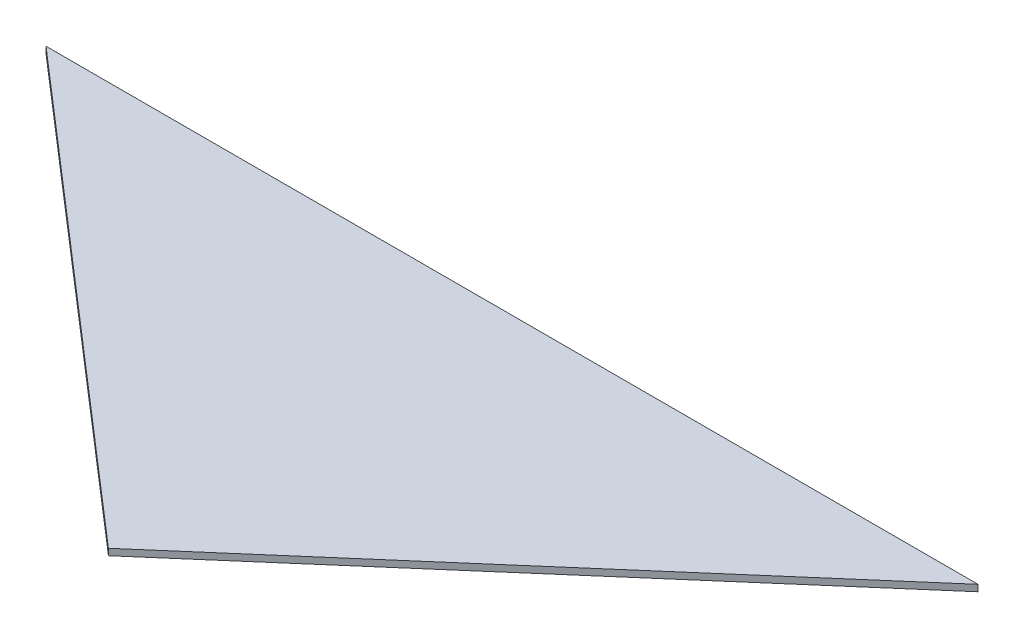
ISO-10303-21;
HEADER;
FILE_DESCRIPTION(('STEP AP214'),'2;1');
FILE_NAME('part.step','',(''),(''),'','','');
FILE_SCHEMA(('AUTOMOTIVE_DESIGN { 1 0 10303 214 1 1 1 1 }'));
ENDSEC;
DATA;
#1=APPLICATION_CONTEXT('core data for automotive mechanical design processes');
#2=APPLICATION_PROTOCOL_DEFINITION('international standard','automotive_design',2000,#1);
#3=PRODUCT_CONTEXT('',#1,'mechanical');
#4=PRODUCT('Part','Part','',(#3));
#5=PRODUCT_RELATED_PRODUCT_CATEGORY('part','',(#4));
#6=PRODUCT_DEFINITION_FORMATION('','',#4);
#7=PRODUCT_DEFINITION_CONTEXT('part definition',#1,'design');
#8=PRODUCT_DEFINITION('design','',#6,#7);
#9=PRODUCT_DEFINITION_SHAPE('','',#8);
#10=(LENGTH_UNIT() NAMED_UNIT(*) SI_UNIT(.MILLI.,.METRE.));
#11=(NAMED_UNIT(*) PLANE_ANGLE_UNIT() SI_UNIT($,.RADIAN.));
#12=(NAMED_UNIT(*) SI_UNIT($,.STERADIAN.) SOLID_ANGLE_UNIT());
#13=UNCERTAINTY_MEASURE_WITH_UNIT(LENGTH_MEASURE(1.E-05),#10,'distance_accuracy_value','');
#14=(GEOMETRIC_REPRESENTATION_CONTEXT(3) GLOBAL_UNCERTAINTY_ASSIGNED_CONTEXT((#13)) GLOBAL_UNIT_ASSIGNED_CONTEXT((#10,
#11,#12)) REPRESENTATION_CONTEXT('',''));
#15=CARTESIAN_POINT('',(0.,0.,0.));
#16=DIRECTION('',(0.,0.,1.));
#17=DIRECTION('',(1.,0.,0.));
#18=AXIS2_PLACEMENT_3D('',#15,#16,#17);
#19=CARTESIAN_POINT('',(-195.942857142857,6.35,226.255322634426));
#20=DIRECTION('',(-0.654653670707977,0.,0.755928946018455));
#21=DIRECTION('',(0.755928946018455,0.,0.654653670707977));
#22=AXIS2_PLACEMENT_3D('',#19,#20,#21);
#23=PLANE('',#22);
#24=DIRECTION('',(-0.755928946018455,0.,-0.654653670707977));
#25=VECTOR('',#24,1.);
#26=CARTESIAN_POINT('',(-195.942857142857,0.,226.255322634426));
#27=LINE('',#26,#25);
#28=CARTESIAN_POINT('',(0.,0.,395.946814610245));
#29=VERTEX_POINT('',#28);
#30=CARTESIAN_POINT('',(-457.2,0.,1.44222201478767E-13));
#31=VERTEX_POINT('',#30);
#32=EDGE_CURVE('E69',#29,#31,#27,.T.);
#33=ORIENTED_EDGE('',*,*,#32,.F.);
#34=DIRECTION('',(0.,-1.,0.));
#35=VECTOR('',#34,1.);
#36=CARTESIAN_POINT('',(0.,6.35,395.946814610245));
#37=LINE('',#36,#35);
#38=CARTESIAN_POINT('',(0.,6.35,395.946814610245));
#39=VERTEX_POINT('',#38);
#40=EDGE_CURVE('E11',#39,#29,#37,.T.);
#41=ORIENTED_EDGE('',*,*,#40,.F.);
#42=DIRECTION('',(-0.755928946018455,0.,-0.654653670707977));
#43=VECTOR('',#42,1.);
#44=CARTESIAN_POINT('',(-195.942857142857,6.35,226.255322634426));
#45=LINE('',#44,#43);
#46=CARTESIAN_POINT('',(-457.2,6.35,1.44222201478767E-13));
#47=VERTEX_POINT('',#46);
#48=EDGE_CURVE('E67',#39,#47,#45,.T.);
#49=ORIENTED_EDGE('',*,*,#48,.T.);
#50=DIRECTION('',(0.,-1.,0.));
#51=VECTOR('',#50,1.);
#52=CARTESIAN_POINT('',(-457.2,6.35,1.44222201478767E-13));
#53=LINE('',#52,#51);
#54=EDGE_CURVE('E49',#47,#31,#53,.T.);
#55=ORIENTED_EDGE('',*,*,#54,.T.);
#56=EDGE_LOOP('',(#33,#41,#49,#55));
#57=FACE_BOUND('',#56,.T.);
#58=ADVANCED_FACE('F33',(#57),#23,.T.);
#59=CARTESIAN_POINT('',(195.942857142857,6.35,226.255322634426));
#60=DIRECTION('',(-0.654653670707977,0.,-0.755928946018454));
#61=DIRECTION('',(-0.755928946018455,0.,0.654653670707977));
#62=AXIS2_PLACEMENT_3D('',#59,#60,#61);
#63=PLANE('',#62);
#64=DIRECTION('',(0.755928946018455,0.,-0.654653670707977));
#65=VECTOR('',#64,1.);
#66=CARTESIAN_POINT('',(195.942857142857,0.,226.255322634426));
#67=LINE('',#66,#65);
#68=CARTESIAN_POINT('',(457.2,0.,-1.68259235058562E-13));
#69=VERTEX_POINT('',#68);
#70=EDGE_CURVE('E81',#29,#69,#67,.T.);
#71=ORIENTED_EDGE('',*,*,#70,.T.);
#72=DIRECTION('',(0.,-1.,0.));
#73=VECTOR('',#72,1.);
#74=CARTESIAN_POINT('',(457.2,6.35,-1.68259235058562E-13));
#75=LINE('',#74,#73);
#76=CARTESIAN_POINT('',(457.2,6.35,-1.68259235058562E-13));
#77=VERTEX_POINT('',#76);
#78=EDGE_CURVE('E41',#77,#69,#75,.T.);
#79=ORIENTED_EDGE('',*,*,#78,.F.);
#80=DIRECTION('',(0.755928946018455,0.,-0.654653670707977));
#81=VECTOR('',#80,1.);
#82=CARTESIAN_POINT('',(195.942857142857,6.35,226.255322634426));
#83=LINE('',#82,#81);
#84=EDGE_CURVE('E72',#39,#77,#83,.T.);
#85=ORIENTED_EDGE('',*,*,#84,.F.);
#86=ORIENTED_EDGE('',*,*,#40,.T.);
#87=EDGE_LOOP('',(#71,#79,#85,#86));
#88=FACE_BOUND('',#87,.T.);
#89=ADVANCED_FACE('F73',(#88),#63,.F.);
#90=CARTESIAN_POINT('',(0.,6.35,0.));
#91=DIRECTION('',(0.,0.,-1.));
#92=DIRECTION('',(-1.,0.,0.));
#93=AXIS2_PLACEMENT_3D('',#90,#91,#92);
#94=PLANE('',#93);
#95=DIRECTION('',(1.,0.,0.));
#96=VECTOR('',#95,1.);
#97=CARTESIAN_POINT('',(0.,0.,0.));
#98=LINE('',#97,#96);
#99=EDGE_CURVE('E78',#31,#69,#98,.T.);
#100=ORIENTED_EDGE('',*,*,#99,.F.);
#101=ORIENTED_EDGE('',*,*,#54,.F.);
#102=DIRECTION('',(1.,0.,0.));
#103=VECTOR('',#102,1.);
#104=CARTESIAN_POINT('',(0.,6.35,0.));
#105=LINE('',#104,#103);
#106=EDGE_CURVE('E75',#47,#77,#105,.T.);
#107=ORIENTED_EDGE('',*,*,#106,.T.);
#108=ORIENTED_EDGE('',*,*,#78,.T.);
#109=EDGE_LOOP('',(#100,#101,#107,#108));
#110=FACE_BOUND('',#109,.T.);
#111=ADVANCED_FACE('F89',(#110),#94,.T.);
#112=CARTESIAN_POINT('',(0.,6.35,0.));
#113=DIRECTION('',(0.,1.,0.));
#114=DIRECTION('',(0.,0.,1.));
#115=AXIS2_PLACEMENT_3D('',#112,#113,#114);
#116=PLANE('',#115);
#117=ORIENTED_EDGE('',*,*,#48,.F.);
#118=ORIENTED_EDGE('',*,*,#84,.T.);
#119=ORIENTED_EDGE('',*,*,#106,.F.);
#120=EDGE_LOOP('',(#117,#118,#119));
#121=FACE_BOUND('',#120,.T.);
#122=ADVANCED_FACE('F77',(#121),#116,.T.);
#123=CARTESIAN_POINT('',(0.,0.,0.));
#124=DIRECTION('',(0.,1.,0.));
#125=DIRECTION('',(0.,0.,1.));
#126=AXIS2_PLACEMENT_3D('',#123,#124,#125);
#127=PLANE('',#126);
#128=ORIENTED_EDGE('',*,*,#32,.T.);
#129=ORIENTED_EDGE('',*,*,#99,.T.);
#130=ORIENTED_EDGE('',*,*,#70,.F.);
#131=EDGE_LOOP('',(#128,#129,#130));
#132=FACE_BOUND('',#131,.T.);
#133=ADVANCED_FACE('F88',(#132),#127,.F.);
#134=CLOSED_SHELL('',(#58,#89,#111,#122,#133));
#135=MANIFOLD_SOLID_BREP('B2',#134);
#136=ADVANCED_BREP_SHAPE_REPRESENTATION('',(#18,#135),#14);
#137=SHAPE_DEFINITION_REPRESENTATION(#9,#136);
ENDSEC;
END-ISO-10303-21;
